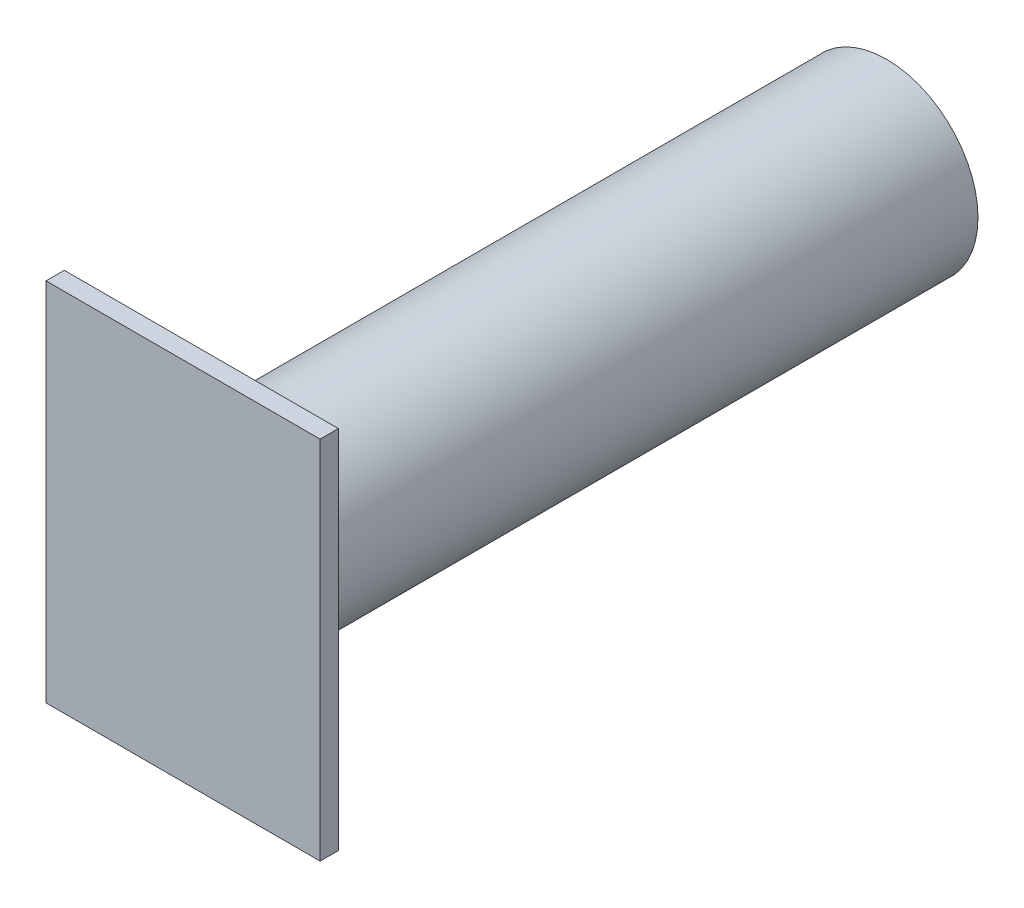
ISO-10303-21;
HEADER;
FILE_DESCRIPTION(('STEP AP214'),'2;1');
FILE_NAME('part.step','',(''),(''),'','','');
FILE_SCHEMA(('AUTOMOTIVE_DESIGN { 1 0 10303 214 1 1 1 1 }'));
ENDSEC;
DATA;
#1=APPLICATION_CONTEXT('core data for automotive mechanical design processes');
#2=APPLICATION_PROTOCOL_DEFINITION('international standard','automotive_design',2000,#1);
#3=PRODUCT_CONTEXT('',#1,'mechanical');
#4=PRODUCT('Part','Part','',(#3));
#5=PRODUCT_RELATED_PRODUCT_CATEGORY('part','',(#4));
#6=PRODUCT_DEFINITION_FORMATION('','',#4);
#7=PRODUCT_DEFINITION_CONTEXT('part definition',#1,'design');
#8=PRODUCT_DEFINITION('design','',#6,#7);
#9=PRODUCT_DEFINITION_SHAPE('','',#8);
#10=(LENGTH_UNIT() NAMED_UNIT(*) SI_UNIT(.MILLI.,.METRE.));
#11=(NAMED_UNIT(*) PLANE_ANGLE_UNIT() SI_UNIT($,.RADIAN.));
#12=(NAMED_UNIT(*) SI_UNIT($,.STERADIAN.) SOLID_ANGLE_UNIT());
#13=UNCERTAINTY_MEASURE_WITH_UNIT(LENGTH_MEASURE(1.E-05),#10,'distance_accuracy_value','');
#14=(GEOMETRIC_REPRESENTATION_CONTEXT(3) GLOBAL_UNCERTAINTY_ASSIGNED_CONTEXT((#13)) GLOBAL_UNIT_ASSIGNED_CONTEXT((#10,
#11,#12)) REPRESENTATION_CONTEXT('',''));
#15=CARTESIAN_POINT('',(0.,0.,0.));
#16=DIRECTION('',(0.,0.,1.));
#17=DIRECTION('',(1.,0.,0.));
#18=AXIS2_PLACEMENT_3D('',#15,#16,#17);
#19=CARTESIAN_POINT('',(0.,0.,75.));
#20=DIRECTION('',(0.,0.,-1.));
#21=DIRECTION('',(-1.,0.,0.));
#22=AXIS2_PLACEMENT_3D('',#19,#20,#21);
#23=CYLINDRICAL_SURFACE('',#22,10.);
#24=CARTESIAN_POINT('',(0.,0.,75.));
#25=DIRECTION('',(0.,0.,1.));
#26=DIRECTION('',(1.,0.,0.));
#27=AXIS2_PLACEMENT_3D('',#24,#25,#26);
#28=CIRCLE('',#27,10.);
#29=CARTESIAN_POINT('',(10.,0.,75.));
#30=VERTEX_POINT('',#29);
#31=EDGE_CURVE('E11',#30,#30,#28,.T.);
#32=ORIENTED_EDGE('',*,*,#31,.F.);
#33=EDGE_LOOP('',(#32));
#34=FACE_BOUND('',#33,.T.);
#35=CARTESIAN_POINT('',(0.,0.,0.));
#36=DIRECTION('',(0.,0.,1.));
#37=DIRECTION('',(1.,0.,0.));
#38=AXIS2_PLACEMENT_3D('',#35,#36,#37);
#39=CIRCLE('',#38,10.);
#40=CARTESIAN_POINT('',(10.,0.,0.));
#41=VERTEX_POINT('',#40);
#42=EDGE_CURVE('E46',#41,#41,#39,.T.);
#43=ORIENTED_EDGE('',*,*,#42,.T.);
#44=EDGE_LOOP('',(#43));
#45=FACE_BOUND('',#44,.T.);
#46=ADVANCED_FACE('F43',(#34,#45),#23,.T.);
#47=CARTESIAN_POINT('',(0.,0.,0.));
#48=DIRECTION('',(0.,0.,1.));
#49=DIRECTION('',(1.,0.,0.));
#50=AXIS2_PLACEMENT_3D('',#47,#48,#49);
#51=PLANE('',#50);
#52=ORIENTED_EDGE('',*,*,#42,.F.);
#53=EDGE_LOOP('',(#52));
#54=FACE_BOUND('',#53,.T.);
#55=ADVANCED_FACE('F135',(#54),#51,.F.);
#56=CARTESIAN_POINT('',(15.,-20.,77.));
#57=DIRECTION('',(-1.,0.,0.));
#58=DIRECTION('',(0.,0.,1.));
#59=AXIS2_PLACEMENT_3D('',#56,#57,#58);
#60=PLANE('',#59);
#61=DIRECTION('',(0.,1.,0.));
#62=VECTOR('',#61,1.);
#63=CARTESIAN_POINT('',(15.,-20.,75.));
#64=LINE('',#63,#62);
#65=CARTESIAN_POINT('',(15.,-20.,75.));
#66=VERTEX_POINT('',#65);
#67=CARTESIAN_POINT('',(15.,20.,75.));
#68=VERTEX_POINT('',#67);
#69=EDGE_CURVE('E115',#66,#68,#64,.T.);
#70=ORIENTED_EDGE('',*,*,#69,.T.);
#71=DIRECTION('',(0.,0.,-1.));
#72=VECTOR('',#71,1.);
#73=CARTESIAN_POINT('',(15.,20.,77.));
#74=LINE('',#73,#72);
#75=CARTESIAN_POINT('',(15.,20.,77.));
#76=VERTEX_POINT('',#75);
#77=EDGE_CURVE('E104',#76,#68,#74,.T.);
#78=ORIENTED_EDGE('',*,*,#77,.F.);
#79=DIRECTION('',(0.,1.,0.));
#80=VECTOR('',#79,1.);
#81=CARTESIAN_POINT('',(15.,-20.,77.));
#82=LINE('',#81,#80);
#83=CARTESIAN_POINT('',(15.,-20.,77.));
#84=VERTEX_POINT('',#83);
#85=EDGE_CURVE('E96',#84,#76,#82,.T.);
#86=ORIENTED_EDGE('',*,*,#85,.F.);
#87=DIRECTION('',(0.,0.,-1.));
#88=VECTOR('',#87,1.);
#89=CARTESIAN_POINT('',(15.,-20.,77.));
#90=LINE('',#89,#88);
#91=EDGE_CURVE('E111',#84,#66,#90,.T.);
#92=ORIENTED_EDGE('',*,*,#91,.T.);
#93=EDGE_LOOP('',(#70,#78,#86,#92));
#94=FACE_BOUND('',#93,.T.);
#95=ADVANCED_FACE('F137',(#94),#60,.F.);
#96=CARTESIAN_POINT('',(-15.,20.,77.));
#97=DIRECTION('',(0.,-1.,0.));
#98=DIRECTION('',(0.,0.,-1.));
#99=AXIS2_PLACEMENT_3D('',#96,#97,#98);
#100=PLANE('',#99);
#101=DIRECTION('',(-1.,0.,0.));
#102=VECTOR('',#101,1.);
#103=CARTESIAN_POINT('',(-15.,20.,75.));
#104=LINE('',#103,#102);
#105=CARTESIAN_POINT('',(-15.,20.,75.));
#106=VERTEX_POINT('',#105);
#107=EDGE_CURVE('E102',#68,#106,#104,.T.);
#108=ORIENTED_EDGE('',*,*,#107,.T.);
#109=DIRECTION('',(0.,0.,-1.));
#110=VECTOR('',#109,1.);
#111=CARTESIAN_POINT('',(-15.,20.,77.));
#112=LINE('',#111,#110);
#113=CARTESIAN_POINT('',(-15.,20.,77.));
#114=VERTEX_POINT('',#113);
#115=EDGE_CURVE('E100',#114,#106,#112,.T.);
#116=ORIENTED_EDGE('',*,*,#115,.F.);
#117=DIRECTION('',(-1.,0.,0.));
#118=VECTOR('',#117,1.);
#119=CARTESIAN_POINT('',(-15.,20.,77.));
#120=LINE('',#119,#118);
#121=EDGE_CURVE('E91',#76,#114,#120,.T.);
#122=ORIENTED_EDGE('',*,*,#121,.F.);
#123=ORIENTED_EDGE('',*,*,#77,.T.);
#124=EDGE_LOOP('',(#108,#116,#122,#123));
#125=FACE_BOUND('',#124,.T.);
#126=ADVANCED_FACE('F101',(#125),#100,.F.);
#127=CARTESIAN_POINT('',(-15.,-20.,77.));
#128=DIRECTION('',(1.,0.,0.));
#129=DIRECTION('',(0.,0.,-1.));
#130=AXIS2_PLACEMENT_3D('',#127,#128,#129);
#131=PLANE('',#130);
#132=DIRECTION('',(0.,-1.,0.));
#133=VECTOR('',#132,1.);
#134=CARTESIAN_POINT('',(-15.,-20.,75.));
#135=LINE('',#134,#133);
#136=CARTESIAN_POINT('',(-15.,-20.,75.));
#137=VERTEX_POINT('',#136);
#138=EDGE_CURVE('E77',#106,#137,#135,.T.);
#139=ORIENTED_EDGE('',*,*,#138,.T.);
#140=DIRECTION('',(0.,0.,-1.));
#141=VECTOR('',#140,1.);
#142=CARTESIAN_POINT('',(-15.,-20.,77.));
#143=LINE('',#142,#141);
#144=CARTESIAN_POINT('',(-15.,-20.,77.));
#145=VERTEX_POINT('',#144);
#146=EDGE_CURVE('E105',#145,#137,#143,.T.);
#147=ORIENTED_EDGE('',*,*,#146,.F.);
#148=DIRECTION('',(0.,-1.,0.));
#149=VECTOR('',#148,1.);
#150=CARTESIAN_POINT('',(-15.,-20.,77.));
#151=LINE('',#150,#149);
#152=EDGE_CURVE('E94',#114,#145,#151,.T.);
#153=ORIENTED_EDGE('',*,*,#152,.F.);
#154=ORIENTED_EDGE('',*,*,#115,.T.);
#155=EDGE_LOOP('',(#139,#147,#153,#154));
#156=FACE_BOUND('',#155,.T.);
#157=ADVANCED_FACE('F107',(#156),#131,.F.);
#158=CARTESIAN_POINT('',(-15.,-20.,77.));
#159=DIRECTION('',(0.,1.,0.));
#160=DIRECTION('',(0.,0.,1.));
#161=AXIS2_PLACEMENT_3D('',#158,#159,#160);
#162=PLANE('',#161);
#163=DIRECTION('',(1.,0.,0.));
#164=VECTOR('',#163,1.);
#165=CARTESIAN_POINT('',(-15.,-20.,75.));
#166=LINE('',#165,#164);
#167=EDGE_CURVE('E83',#137,#66,#166,.T.);
#168=ORIENTED_EDGE('',*,*,#167,.T.);
#169=ORIENTED_EDGE('',*,*,#91,.F.);
#170=DIRECTION('',(1.,0.,0.));
#171=VECTOR('',#170,1.);
#172=CARTESIAN_POINT('',(-15.,-20.,77.));
#173=LINE('',#172,#171);
#174=EDGE_CURVE('E60',#145,#84,#173,.T.);
#175=ORIENTED_EDGE('',*,*,#174,.F.);
#176=ORIENTED_EDGE('',*,*,#146,.T.);
#177=EDGE_LOOP('',(#168,#169,#175,#176));
#178=FACE_BOUND('',#177,.T.);
#179=ADVANCED_FACE('F150',(#178),#162,.F.);
#180=CARTESIAN_POINT('',(0.,0.,77.));
#181=DIRECTION('',(0.,0.,-1.));
#182=DIRECTION('',(-1.,0.,0.));
#183=AXIS2_PLACEMENT_3D('',#180,#181,#182);
#184=PLANE('',#183);
#185=ORIENTED_EDGE('',*,*,#85,.T.);
#186=ORIENTED_EDGE('',*,*,#121,.T.);
#187=ORIENTED_EDGE('',*,*,#152,.T.);
#188=ORIENTED_EDGE('',*,*,#174,.T.);
#189=EDGE_LOOP('',(#185,#186,#187,#188));
#190=FACE_BOUND('',#189,.T.);
#191=ADVANCED_FACE('F92',(#190),#184,.F.);
#192=CARTESIAN_POINT('',(0.,0.,75.));
#193=DIRECTION('',(0.,0.,-1.));
#194=DIRECTION('',(-1.,0.,0.));
#195=AXIS2_PLACEMENT_3D('',#192,#193,#194);
#196=PLANE('',#195);
#197=ORIENTED_EDGE('',*,*,#31,.T.);
#198=EDGE_LOOP('',(#197));
#199=FACE_BOUND('',#198,.T.);
#200=ORIENTED_EDGE('',*,*,#69,.F.);
#201=ORIENTED_EDGE('',*,*,#167,.F.);
#202=ORIENTED_EDGE('',*,*,#138,.F.);
#203=ORIENTED_EDGE('',*,*,#107,.F.);
#204=EDGE_LOOP('',(#200,#201,#202,#203));
#205=FACE_BOUND('',#204,.T.);
#206=ADVANCED_FACE('F153',(#199,#205),#196,.T.);
#207=CLOSED_SHELL('',(#46,#55,#95,#126,#157,#179,#191,#206));
#208=MANIFOLD_SOLID_BREP('B2',#207);
#209=ADVANCED_BREP_SHAPE_REPRESENTATION('',(#18,#208),#14);
#210=SHAPE_DEFINITION_REPRESENTATION(#9,#209);
ENDSEC;
END-ISO-10303-21;
